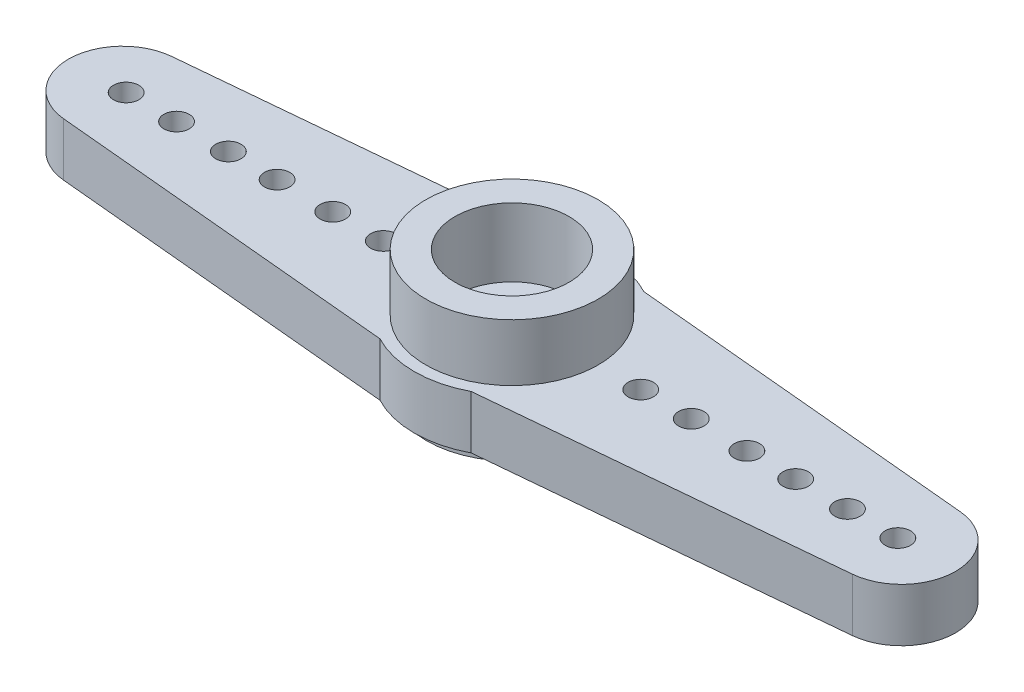
ISO-10303-21;
HEADER;
FILE_DESCRIPTION(('STEP AP214'),'2;1');
FILE_NAME('part.step','',(''),(''),'','','');
FILE_SCHEMA(('AUTOMOTIVE_DESIGN { 1 0 10303 214 1 1 1 1 }'));
ENDSEC;
DATA;
#1=APPLICATION_CONTEXT('core data for automotive mechanical design processes');
#2=APPLICATION_PROTOCOL_DEFINITION('international standard','automotive_design',2000,#1);
#3=PRODUCT_CONTEXT('',#1,'mechanical');
#4=PRODUCT('Part','Part','',(#3));
#5=PRODUCT_RELATED_PRODUCT_CATEGORY('part','',(#4));
#6=PRODUCT_DEFINITION_FORMATION('','',#4);
#7=PRODUCT_DEFINITION_CONTEXT('part definition',#1,'design');
#8=PRODUCT_DEFINITION('design','',#6,#7);
#9=PRODUCT_DEFINITION_SHAPE('','',#8);
#10=(LENGTH_UNIT() NAMED_UNIT(*) SI_UNIT(.MILLI.,.METRE.));
#11=(NAMED_UNIT(*) PLANE_ANGLE_UNIT() SI_UNIT($,.RADIAN.));
#12=(NAMED_UNIT(*) SI_UNIT($,.STERADIAN.) SOLID_ANGLE_UNIT());
#13=UNCERTAINTY_MEASURE_WITH_UNIT(LENGTH_MEASURE(1.E-05),#10,'distance_accuracy_value','');
#14=(GEOMETRIC_REPRESENTATION_CONTEXT(3) GLOBAL_UNCERTAINTY_ASSIGNED_CONTEXT((#13)) GLOBAL_UNIT_ASSIGNED_CONTEXT((#10,
#11,#12)) REPRESENTATION_CONTEXT('',''));
#15=CARTESIAN_POINT('',(0.,0.,0.));
#16=DIRECTION('',(0.,0.,1.));
#17=DIRECTION('',(1.,0.,0.));
#18=AXIS2_PLACEMENT_3D('',#15,#16,#17);
#19=CARTESIAN_POINT('',(0.,1.65,0.));
#20=DIRECTION('',(0.,1.,0.));
#21=DIRECTION('',(0.,0.,1.));
#22=AXIS2_PLACEMENT_3D('',#19,#20,#21);
#23=PLANE('',#22);
#24=CARTESIAN_POINT('',(0.,1.65,0.));
#25=DIRECTION('',(0.,1.,0.));
#26=DIRECTION('',(0.,0.,1.));
#27=AXIS2_PLACEMENT_3D('',#24,#25,#26);
#28=CIRCLE('',#27,1.15);
#29=CARTESIAN_POINT('',(0.,1.65,1.15));
#30=VERTEX_POINT('',#29);
#31=EDGE_CURVE('E20',#30,#30,#28,.F.);
#32=ORIENTED_EDGE('',*,*,#31,.T.);
#33=EDGE_LOOP('',(#32));
#34=FACE_BOUND('',#33,.T.);
#35=CARTESIAN_POINT('',(0.,1.65,0.));
#36=DIRECTION('',(0.,1.,0.));
#37=DIRECTION('',(0.,0.,1.));
#38=AXIS2_PLACEMENT_3D('',#35,#36,#37);
#39=CIRCLE('',#38,2.25);
#40=CARTESIAN_POINT('',(0.,1.65,2.25));
#41=VERTEX_POINT('',#40);
#42=EDGE_CURVE('E231',#41,#41,#39,.T.);
#43=ORIENTED_EDGE('',*,*,#42,.T.);
#44=EDGE_LOOP('',(#43));
#45=FACE_BOUND('',#44,.T.);
#46=ADVANCED_FACE('F17',(#34,#45),#23,.T.);
#47=CARTESIAN_POINT('',(0.,0.,0.));
#48=DIRECTION('',(0.,1.,0.));
#49=DIRECTION('',(0.,0.,1.));
#50=AXIS2_PLACEMENT_3D('',#47,#48,#49);
#51=CYLINDRICAL_SURFACE('',#50,1.15);
#52=ORIENTED_EDGE('',*,*,#31,.F.);
#53=EDGE_LOOP('',(#52));
#54=FACE_BOUND('',#53,.T.);
#55=CARTESIAN_POINT('',(0.,0.75,0.));
#56=DIRECTION('',(0.,1.,0.));
#57=DIRECTION('',(0.,0.,1.));
#58=AXIS2_PLACEMENT_3D('',#55,#56,#57);
#59=CIRCLE('',#58,1.15);
#60=CARTESIAN_POINT('',(0.,0.75,1.15));
#61=VERTEX_POINT('',#60);
#62=EDGE_CURVE('E229',#61,#61,#59,.T.);
#63=ORIENTED_EDGE('',*,*,#62,.F.);
#64=EDGE_LOOP('',(#63));
#65=FACE_BOUND('',#64,.T.);
#66=ADVANCED_FACE('F239',(#54,#65),#51,.F.);
#67=CARTESIAN_POINT('',(0.,1.65,0.));
#68=DIRECTION('',(0.,1.,0.));
#69=DIRECTION('',(0.,0.,1.));
#70=AXIS2_PLACEMENT_3D('',#67,#68,#69);
#71=CYLINDRICAL_SURFACE('',#70,2.25);
#72=ORIENTED_EDGE('',*,*,#42,.F.);
#73=EDGE_LOOP('',(#72));
#74=FACE_BOUND('',#73,.T.);
#75=CARTESIAN_POINT('',(0.,4.35,0.));
#76=DIRECTION('',(0.,1.,0.));
#77=DIRECTION('',(0.,0.,1.));
#78=AXIS2_PLACEMENT_3D('',#75,#76,#77);
#79=CIRCLE('',#78,2.25);
#80=CARTESIAN_POINT('',(0.,4.35,2.25));
#81=VERTEX_POINT('',#80);
#82=EDGE_CURVE('E226',#81,#81,#79,.F.);
#83=ORIENTED_EDGE('',*,*,#82,.F.);
#84=EDGE_LOOP('',(#83));
#85=FACE_BOUND('',#84,.T.);
#86=ADVANCED_FACE('F242',(#74,#85),#71,.F.);
#87=CARTESIAN_POINT('',(0.,0.75,0.));
#88=DIRECTION('',(0.,-1.,0.));
#89=DIRECTION('',(0.,0.,-1.));
#90=AXIS2_PLACEMENT_3D('',#87,#88,#89);
#91=PLANE('',#90);
#92=ORIENTED_EDGE('',*,*,#62,.T.);
#93=EDGE_LOOP('',(#92));
#94=FACE_BOUND('',#93,.T.);
#95=CARTESIAN_POINT('',(0.,0.75,0.));
#96=DIRECTION('',(0.,-1.,0.));
#97=DIRECTION('',(0.,0.,-1.));
#98=AXIS2_PLACEMENT_3D('',#95,#96,#97);
#99=CIRCLE('',#98,2.425);
#100=CARTESIAN_POINT('',(0.,0.75,-2.425));
#101=VERTEX_POINT('',#100);
#102=EDGE_CURVE('E223',#101,#101,#99,.T.);
#103=ORIENTED_EDGE('',*,*,#102,.T.);
#104=EDGE_LOOP('',(#103));
#105=FACE_BOUND('',#104,.T.);
#106=ADVANCED_FACE('F245',(#94,#105),#91,.T.);
#107=CARTESIAN_POINT('',(0.,4.35,0.));
#108=DIRECTION('',(0.,1.,0.));
#109=DIRECTION('',(0.,0.,1.));
#110=AXIS2_PLACEMENT_3D('',#107,#108,#109);
#111=PLANE('',#110);
#112=ORIENTED_EDGE('',*,*,#82,.T.);
#113=EDGE_LOOP('',(#112));
#114=FACE_BOUND('',#113,.T.);
#115=CARTESIAN_POINT('',(0.,4.35,0.));
#116=DIRECTION('',(0.,-1.,0.));
#117=DIRECTION('',(0.,0.,-1.));
#118=AXIS2_PLACEMENT_3D('',#115,#116,#117);
#119=CIRCLE('',#118,3.4);
#120=CARTESIAN_POINT('',(0.,4.35,-3.4));
#121=VERTEX_POINT('',#120);
#122=EDGE_CURVE('E220',#121,#121,#119,.T.);
#123=ORIENTED_EDGE('',*,*,#122,.F.);
#124=EDGE_LOOP('',(#123));
#125=FACE_BOUND('',#124,.T.);
#126=ADVANCED_FACE('F248',(#114,#125),#111,.T.);
#127=CARTESIAN_POINT('',(0.,0.75,0.));
#128=DIRECTION('',(0.,-1.,0.));
#129=DIRECTION('',(0.,0.,-1.));
#130=AXIS2_PLACEMENT_3D('',#127,#128,#129);
#131=CYLINDRICAL_SURFACE('',#130,2.425);
#132=ORIENTED_EDGE('',*,*,#102,.F.);
#133=EDGE_LOOP('',(#132));
#134=FACE_BOUND('',#133,.T.);
#135=CARTESIAN_POINT('',(0.,-0.5,0.));
#136=DIRECTION('',(0.,-1.,0.));
#137=DIRECTION('',(0.,0.,-1.));
#138=AXIS2_PLACEMENT_3D('',#135,#136,#137);
#139=CIRCLE('',#138,2.425);
#140=CARTESIAN_POINT('',(0.,-0.5,-2.425));
#141=VERTEX_POINT('',#140);
#142=EDGE_CURVE('E217',#141,#141,#139,.F.);
#143=ORIENTED_EDGE('',*,*,#142,.F.);
#144=EDGE_LOOP('',(#143));
#145=FACE_BOUND('',#144,.T.);
#146=ADVANCED_FACE('F252',(#134,#145),#131,.F.);
#147=CARTESIAN_POINT('',(0.,4.35,0.));
#148=DIRECTION('',(0.,-1.,0.));
#149=DIRECTION('',(0.,0.,-1.));
#150=AXIS2_PLACEMENT_3D('',#147,#148,#149);
#151=CYLINDRICAL_SURFACE('',#150,3.4);
#152=ORIENTED_EDGE('',*,*,#122,.T.);
#153=EDGE_LOOP('',(#152));
#154=FACE_BOUND('',#153,.T.);
#155=CARTESIAN_POINT('',(0.,2.1,0.));
#156=DIRECTION('',(0.,-1.,0.));
#157=DIRECTION('',(0.,0.,-1.));
#158=AXIS2_PLACEMENT_3D('',#155,#156,#157);
#159=CIRCLE('',#158,3.4);
#160=CARTESIAN_POINT('',(0.,2.1,-3.4));
#161=VERTEX_POINT('',#160);
#162=EDGE_CURVE('E214',#161,#161,#159,.F.);
#163=ORIENTED_EDGE('',*,*,#162,.T.);
#164=EDGE_LOOP('',(#163));
#165=FACE_BOUND('',#164,.T.);
#166=ADVANCED_FACE('F255',(#154,#165),#151,.T.);
#167=CARTESIAN_POINT('',(0.,-0.5,0.));
#168=DIRECTION('',(0.,-1.,0.));
#169=DIRECTION('',(0.,0.,-1.));
#170=AXIS2_PLACEMENT_3D('',#167,#168,#169);
#171=PLANE('',#170);
#172=CARTESIAN_POINT('',(0.,-0.5,0.));
#173=DIRECTION('',(0.,1.,0.));
#174=DIRECTION('',(0.,0.,1.));
#175=AXIS2_PLACEMENT_3D('',#172,#173,#174);
#176=CIRCLE('',#175,3.375);
#177=CARTESIAN_POINT('',(0.,-0.5,3.375));
#178=VERTEX_POINT('',#177);
#179=EDGE_CURVE('E211',#178,#178,#176,.T.);
#180=ORIENTED_EDGE('',*,*,#179,.F.);
#181=EDGE_LOOP('',(#180));
#182=FACE_BOUND('',#181,.T.);
#183=ORIENTED_EDGE('',*,*,#142,.T.);
#184=EDGE_LOOP('',(#183));
#185=FACE_BOUND('',#184,.T.);
#186=ADVANCED_FACE('F259',(#182,#185),#171,.T.);
#187=CARTESIAN_POINT('',(0.,2.1,0.));
#188=DIRECTION('',(0.,-1.,0.));
#189=DIRECTION('',(0.,0.,-1.));
#190=AXIS2_PLACEMENT_3D('',#187,#188,#189);
#191=PLANE('',#190);
#192=DIRECTION('',(-0.995716456666093,0.,0.0924593852689943));
#193=VECTOR('',#192,1.);
#194=CARTESIAN_POINT('',(-17.5,2.1,-1.95));
#195=LINE('',#194,#193);
#196=CARTESIAN_POINT('',(-15.5583528861857,2.1,-2.1302958011074));
#197=VERTEX_POINT('',#196);
#198=CARTESIAN_POINT('',(-1.79999999798423,2.1,-3.40785714209431));
#199=VERTEX_POINT('',#198);
#200=EDGE_CURVE('E87',#197,#199,#195,.F.);
#201=ORIENTED_EDGE('',*,*,#200,.F.);
#202=CARTESIAN_POINT('',(-15.3605397,2.1,0.));
#203=DIRECTION('',(0.,-1.,0.));
#204=DIRECTION('',(0.,0.,-1.));
#205=AXIS2_PLACEMENT_3D('',#202,#203,#204);
#206=CIRCLE('',#205,2.13946027);
#207=CARTESIAN_POINT('',(-15.5583528861545,2.1,2.1302958011103));
#208=VERTEX_POINT('',#207);
#209=EDGE_CURVE('E170',#208,#197,#206,.T.);
#210=ORIENTED_EDGE('',*,*,#209,.F.);
#211=DIRECTION('',(-0.995716456666093,0.,-0.0924593852689943));
#212=VECTOR('',#211,1.);
#213=CARTESIAN_POINT('',(-17.5,2.1,1.95));
#214=LINE('',#213,#212);
#215=CARTESIAN_POINT('',(-1.79999999790833,2.1,3.40785714316399));
#216=VERTEX_POINT('',#215);
#217=EDGE_CURVE('E110',#208,#216,#214,.F.);
#218=ORIENTED_EDGE('',*,*,#217,.T.);
#219=CARTESIAN_POINT('',(0.,2.1,0.));
#220=DIRECTION('',(0.,-1.,0.));
#221=DIRECTION('',(0.,0.,-1.));
#222=AXIS2_PLACEMENT_3D('',#219,#220,#221);
#223=CIRCLE('',#222,3.85402261198172);
#224=CARTESIAN_POINT('',(1.79999999798423,2.1,3.40785714209431));
#225=VERTEX_POINT('',#224);
#226=EDGE_CURVE('E117',#225,#216,#223,.T.);
#227=ORIENTED_EDGE('',*,*,#226,.F.);
#228=DIRECTION('',(0.995716456666093,0.,-0.0924593852689943));
#229=VECTOR('',#228,1.);
#230=CARTESIAN_POINT('',(17.5,2.1,1.95));
#231=LINE('',#230,#229);
#232=CARTESIAN_POINT('',(15.5583528863692,2.1,2.1302958034225));
#233=VERTEX_POINT('',#232);
#234=EDGE_CURVE('E114',#233,#225,#231,.F.);
#235=ORIENTED_EDGE('',*,*,#234,.F.);
#236=CARTESIAN_POINT('',(15.3605397,2.1,0.));
#237=DIRECTION('',(0.,-1.,0.));
#238=DIRECTION('',(0.,0.,-1.));
#239=AXIS2_PLACEMENT_3D('',#236,#237,#238);
#240=CIRCLE('',#239,2.13946027);
#241=CARTESIAN_POINT('',(15.5583528861545,2.1,-2.1302958011103));
#242=VERTEX_POINT('',#241);
#243=EDGE_CURVE('E174',#242,#233,#240,.T.);
#244=ORIENTED_EDGE('',*,*,#243,.F.);
#245=DIRECTION('',(0.995716456666093,0.,0.0924593852689943));
#246=VECTOR('',#245,1.);
#247=CARTESIAN_POINT('',(17.5,2.1,-1.95));
#248=LINE('',#247,#246);
#249=CARTESIAN_POINT('',(1.79999999786316,2.1,-3.40785714316819));
#250=VERTEX_POINT('',#249);
#251=EDGE_CURVE('E90',#242,#250,#248,.F.);
#252=ORIENTED_EDGE('',*,*,#251,.T.);
#253=CARTESIAN_POINT('',(0.,2.1,0.));
#254=DIRECTION('',(0.,-1.,0.));
#255=DIRECTION('',(0.,0.,-1.));
#256=AXIS2_PLACEMENT_3D('',#253,#254,#255);
#257=CIRCLE('',#256,3.85402261198172);
#258=EDGE_CURVE('E80',#199,#250,#257,.T.);
#259=ORIENTED_EDGE('',*,*,#258,.F.);
#260=EDGE_LOOP('',(#201,#210,#218,#227,#235,#244,#252,#259));
#261=FACE_BOUND('',#260,.T.);
#262=CARTESIAN_POINT('',(5.07826722,2.1,0.));
#263=DIRECTION('',(0.,1.,0.));
#264=DIRECTION('',(0.,0.,1.));
#265=AXIS2_PLACEMENT_3D('',#262,#263,#264);
#266=CIRCLE('',#265,0.5);
#267=CARTESIAN_POINT('',(5.07826722,2.1,0.5));
#268=VERTEX_POINT('',#267);
#269=EDGE_CURVE('E101',#268,#268,#266,.F.);
#270=ORIENTED_EDGE('',*,*,#269,.T.);
#271=EDGE_LOOP('',(#270));
#272=FACE_BOUND('',#271,.T.);
#273=CARTESIAN_POINT('',(7.07176458,2.1,0.));
#274=DIRECTION('',(0.,1.,0.));
#275=DIRECTION('',(0.,0.,1.));
#276=AXIS2_PLACEMENT_3D('',#273,#274,#275);
#277=CIRCLE('',#276,0.5);
#278=CARTESIAN_POINT('',(7.07176458,2.1,0.5));
#279=VERTEX_POINT('',#278);
#280=EDGE_CURVE('E178',#279,#279,#277,.F.);
#281=ORIENTED_EDGE('',*,*,#280,.T.);
#282=EDGE_LOOP('',(#281));
#283=FACE_BOUND('',#282,.T.);
#284=CARTESIAN_POINT('',(9.26628033,2.1,0.));
#285=DIRECTION('',(0.,1.,0.));
#286=DIRECTION('',(0.,0.,1.));
#287=AXIS2_PLACEMENT_3D('',#284,#285,#286);
#288=CIRCLE('',#287,0.5);
#289=CARTESIAN_POINT('',(9.26628033,2.1,0.5));
#290=VERTEX_POINT('',#289);
#291=EDGE_CURVE('E181',#290,#290,#288,.F.);
#292=ORIENTED_EDGE('',*,*,#291,.T.);
#293=EDGE_LOOP('',(#292));
#294=FACE_BOUND('',#293,.T.);
#295=CARTESIAN_POINT('',(11.1888846,2.1,0.));
#296=DIRECTION('',(0.,1.,0.));
#297=DIRECTION('',(0.,0.,1.));
#298=AXIS2_PLACEMENT_3D('',#295,#296,#297);
#299=CIRCLE('',#298,0.5);
#300=CARTESIAN_POINT('',(11.1888846,2.1,0.5));
#301=VERTEX_POINT('',#300);
#302=EDGE_CURVE('E184',#301,#301,#299,.F.);
#303=ORIENTED_EDGE('',*,*,#302,.T.);
#304=EDGE_LOOP('',(#303));
#305=FACE_BOUND('',#304,.T.);
#306=CARTESIAN_POINT('',(13.2338717,2.1,0.));
#307=DIRECTION('',(0.,1.,0.));
#308=DIRECTION('',(0.,0.,1.));
#309=AXIS2_PLACEMENT_3D('',#306,#307,#308);
#310=CIRCLE('',#309,0.5);
#311=CARTESIAN_POINT('',(13.2338717,2.1,0.5));
#312=VERTEX_POINT('',#311);
#313=EDGE_CURVE('E187',#312,#312,#310,.F.);
#314=ORIENTED_EDGE('',*,*,#313,.T.);
#315=EDGE_LOOP('',(#314));
#316=FACE_BOUND('',#315,.T.);
#317=CARTESIAN_POINT('',(15.2219818,2.1,0.));
#318=DIRECTION('',(0.,1.,0.));
#319=DIRECTION('',(0.,0.,1.));
#320=AXIS2_PLACEMENT_3D('',#317,#318,#319);
#321=CIRCLE('',#320,0.5);
#322=CARTESIAN_POINT('',(15.2219818,2.1,0.5));
#323=VERTEX_POINT('',#322);
#324=EDGE_CURVE('E190',#323,#323,#321,.F.);
#325=ORIENTED_EDGE('',*,*,#324,.T.);
#326=EDGE_LOOP('',(#325));
#327=FACE_BOUND('',#326,.T.);
#328=CARTESIAN_POINT('',(-15.2219818,2.1,0.));
#329=DIRECTION('',(0.,1.,0.));
#330=DIRECTION('',(0.,0.,1.));
#331=AXIS2_PLACEMENT_3D('',#328,#329,#330);
#332=CIRCLE('',#331,0.5);
#333=CARTESIAN_POINT('',(-15.2219818,2.1,0.5));
#334=VERTEX_POINT('',#333);
#335=EDGE_CURVE('E193',#334,#334,#332,.F.);
#336=ORIENTED_EDGE('',*,*,#335,.T.);
#337=EDGE_LOOP('',(#336));
#338=FACE_BOUND('',#337,.T.);
#339=CARTESIAN_POINT('',(-13.2338717,2.1,0.));
#340=DIRECTION('',(0.,1.,0.));
#341=DIRECTION('',(0.,0.,1.));
#342=AXIS2_PLACEMENT_3D('',#339,#340,#341);
#343=CIRCLE('',#342,0.5);
#344=CARTESIAN_POINT('',(-13.2338717,2.1,0.5));
#345=VERTEX_POINT('',#344);
#346=EDGE_CURVE('E196',#345,#345,#343,.F.);
#347=ORIENTED_EDGE('',*,*,#346,.T.);
#348=EDGE_LOOP('',(#347));
#349=FACE_BOUND('',#348,.T.);
#350=CARTESIAN_POINT('',(-11.1888846,2.1,0.));
#351=DIRECTION('',(0.,1.,0.));
#352=DIRECTION('',(0.,0.,1.));
#353=AXIS2_PLACEMENT_3D('',#350,#351,#352);
#354=CIRCLE('',#353,0.5);
#355=CARTESIAN_POINT('',(-11.1888846,2.1,0.5));
#356=VERTEX_POINT('',#355);
#357=EDGE_CURVE('E199',#356,#356,#354,.F.);
#358=ORIENTED_EDGE('',*,*,#357,.T.);
#359=EDGE_LOOP('',(#358));
#360=FACE_BOUND('',#359,.T.);
#361=CARTESIAN_POINT('',(-9.26628033,2.1,0.));
#362=DIRECTION('',(0.,1.,0.));
#363=DIRECTION('',(0.,0.,1.));
#364=AXIS2_PLACEMENT_3D('',#361,#362,#363);
#365=CIRCLE('',#364,0.5);
#366=CARTESIAN_POINT('',(-9.26628033,2.1,0.5));
#367=VERTEX_POINT('',#366);
#368=EDGE_CURVE('E202',#367,#367,#365,.F.);
#369=ORIENTED_EDGE('',*,*,#368,.T.);
#370=EDGE_LOOP('',(#369));
#371=FACE_BOUND('',#370,.T.);
#372=CARTESIAN_POINT('',(-7.07176458,2.1,0.));
#373=DIRECTION('',(0.,1.,0.));
#374=DIRECTION('',(0.,0.,1.));
#375=AXIS2_PLACEMENT_3D('',#372,#373,#374);
#376=CIRCLE('',#375,0.5);
#377=CARTESIAN_POINT('',(-7.07176458,2.1,0.5));
#378=VERTEX_POINT('',#377);
#379=EDGE_CURVE('E205',#378,#378,#376,.F.);
#380=ORIENTED_EDGE('',*,*,#379,.T.);
#381=EDGE_LOOP('',(#380));
#382=FACE_BOUND('',#381,.T.);
#383=CARTESIAN_POINT('',(-5.07826722,2.1,0.));
#384=DIRECTION('',(0.,1.,0.));
#385=DIRECTION('',(0.,0.,1.));
#386=AXIS2_PLACEMENT_3D('',#383,#384,#385);
#387=CIRCLE('',#386,0.5);
#388=CARTESIAN_POINT('',(-5.07826722,2.1,0.5));
#389=VERTEX_POINT('',#388);
#390=EDGE_CURVE('E208',#389,#389,#387,.F.);
#391=ORIENTED_EDGE('',*,*,#390,.T.);
#392=EDGE_LOOP('',(#391));
#393=FACE_BOUND('',#392,.T.);
#394=ORIENTED_EDGE('',*,*,#162,.F.);
#395=EDGE_LOOP('',(#394));
#396=FACE_BOUND('',#395,.T.);
#397=ADVANCED_FACE('F84',(#261,#272,#283,#294,#305,#316,#327,#338,#349,#360,#371,#382,#393,
#396),#191,.F.);
#398=CARTESIAN_POINT('',(0.,-0.5,0.));
#399=DIRECTION('',(0.,1.,0.));
#400=DIRECTION('',(0.,0.,1.));
#401=AXIS2_PLACEMENT_3D('',#398,#399,#400);
#402=CYLINDRICAL_SURFACE('',#401,3.375);
#403=ORIENTED_EDGE('',*,*,#179,.T.);
#404=EDGE_LOOP('',(#403));
#405=FACE_BOUND('',#404,.T.);
#406=CARTESIAN_POINT('',(0.,0.,0.));
#407=DIRECTION('',(0.,1.,0.));
#408=DIRECTION('',(0.,0.,1.));
#409=AXIS2_PLACEMENT_3D('',#406,#407,#408);
#410=CIRCLE('',#409,3.375);
#411=CARTESIAN_POINT('',(0.,0.,3.375));
#412=VERTEX_POINT('',#411);
#413=EDGE_CURVE('E167',#412,#412,#410,.T.);
#414=ORIENTED_EDGE('',*,*,#413,.F.);
#415=EDGE_LOOP('',(#414));
#416=FACE_BOUND('',#415,.T.);
#417=ADVANCED_FACE('F268',(#405,#416),#402,.T.);
#418=CARTESIAN_POINT('',(-5.07826722,-0.5,0.));
#419=DIRECTION('',(0.,1.,0.));
#420=DIRECTION('',(0.,0.,1.));
#421=AXIS2_PLACEMENT_3D('',#418,#419,#420);
#422=CYLINDRICAL_SURFACE('',#421,0.5);
#423=ORIENTED_EDGE('',*,*,#390,.F.);
#424=EDGE_LOOP('',(#423));
#425=FACE_BOUND('',#424,.T.);
#426=CARTESIAN_POINT('',(-5.07826722,0.,0.));
#427=DIRECTION('',(0.,1.,0.));
#428=DIRECTION('',(0.,0.,1.));
#429=AXIS2_PLACEMENT_3D('',#426,#427,#428);
#430=CIRCLE('',#429,0.5);
#431=CARTESIAN_POINT('',(-5.07826722,0.,0.5));
#432=VERTEX_POINT('',#431);
#433=EDGE_CURVE('E164',#432,#432,#430,.T.);
#434=ORIENTED_EDGE('',*,*,#433,.F.);
#435=EDGE_LOOP('',(#434));
#436=FACE_BOUND('',#435,.T.);
#437=ADVANCED_FACE('F352',(#425,#436),#422,.F.);
#438=CARTESIAN_POINT('',(-7.07176458,-0.5,0.));
#439=DIRECTION('',(0.,1.,0.));
#440=DIRECTION('',(0.,0.,1.));
#441=AXIS2_PLACEMENT_3D('',#438,#439,#440);
#442=CYLINDRICAL_SURFACE('',#441,0.5);
#443=ORIENTED_EDGE('',*,*,#379,.F.);
#444=EDGE_LOOP('',(#443));
#445=FACE_BOUND('',#444,.T.);
#446=CARTESIAN_POINT('',(-7.07176458,0.,0.));
#447=DIRECTION('',(0.,1.,0.));
#448=DIRECTION('',(0.,0.,1.));
#449=AXIS2_PLACEMENT_3D('',#446,#447,#448);
#450=CIRCLE('',#449,0.5);
#451=CARTESIAN_POINT('',(-7.07176458,0.,0.5));
#452=VERTEX_POINT('',#451);
#453=EDGE_CURVE('E161',#452,#452,#450,.T.);
#454=ORIENTED_EDGE('',*,*,#453,.F.);
#455=EDGE_LOOP('',(#454));
#456=FACE_BOUND('',#455,.T.);
#457=ADVANCED_FACE('F348',(#445,#456),#442,.F.);
#458=CARTESIAN_POINT('',(-9.26628033,-0.5,0.));
#459=DIRECTION('',(0.,1.,0.));
#460=DIRECTION('',(0.,0.,1.));
#461=AXIS2_PLACEMENT_3D('',#458,#459,#460);
#462=CYLINDRICAL_SURFACE('',#461,0.5);
#463=ORIENTED_EDGE('',*,*,#368,.F.);
#464=EDGE_LOOP('',(#463));
#465=FACE_BOUND('',#464,.T.);
#466=CARTESIAN_POINT('',(-9.26628033,0.,0.));
#467=DIRECTION('',(0.,1.,0.));
#468=DIRECTION('',(0.,0.,1.));
#469=AXIS2_PLACEMENT_3D('',#466,#467,#468);
#470=CIRCLE('',#469,0.5);
#471=CARTESIAN_POINT('',(-9.26628033,0.,0.5));
#472=VERTEX_POINT('',#471);
#473=EDGE_CURVE('E158',#472,#472,#470,.T.);
#474=ORIENTED_EDGE('',*,*,#473,.F.);
#475=EDGE_LOOP('',(#474));
#476=FACE_BOUND('',#475,.T.);
#477=ADVANCED_FACE('F344',(#465,#476),#462,.F.);
#478=CARTESIAN_POINT('',(-11.1888846,-0.5,0.));
#479=DIRECTION('',(0.,1.,0.));
#480=DIRECTION('',(0.,0.,1.));
#481=AXIS2_PLACEMENT_3D('',#478,#479,#480);
#482=CYLINDRICAL_SURFACE('',#481,0.5);
#483=ORIENTED_EDGE('',*,*,#357,.F.);
#484=EDGE_LOOP('',(#483));
#485=FACE_BOUND('',#484,.T.);
#486=CARTESIAN_POINT('',(-11.1888846,0.,0.));
#487=DIRECTION('',(0.,1.,0.));
#488=DIRECTION('',(0.,0.,1.));
#489=AXIS2_PLACEMENT_3D('',#486,#487,#488);
#490=CIRCLE('',#489,0.5);
#491=CARTESIAN_POINT('',(-11.1888846,0.,0.5));
#492=VERTEX_POINT('',#491);
#493=EDGE_CURVE('E155',#492,#492,#490,.T.);
#494=ORIENTED_EDGE('',*,*,#493,.F.);
#495=EDGE_LOOP('',(#494));
#496=FACE_BOUND('',#495,.T.);
#497=ADVANCED_FACE('F340',(#485,#496),#482,.F.);
#498=CARTESIAN_POINT('',(-13.2338717,-0.5,0.));
#499=DIRECTION('',(0.,1.,0.));
#500=DIRECTION('',(0.,0.,1.));
#501=AXIS2_PLACEMENT_3D('',#498,#499,#500);
#502=CYLINDRICAL_SURFACE('',#501,0.5);
#503=ORIENTED_EDGE('',*,*,#346,.F.);
#504=EDGE_LOOP('',(#503));
#505=FACE_BOUND('',#504,.T.);
#506=CARTESIAN_POINT('',(-13.2338717,0.,0.));
#507=DIRECTION('',(0.,1.,0.));
#508=DIRECTION('',(0.,0.,1.));
#509=AXIS2_PLACEMENT_3D('',#506,#507,#508);
#510=CIRCLE('',#509,0.5);
#511=CARTESIAN_POINT('',(-13.2338717,0.,0.5));
#512=VERTEX_POINT('',#511);
#513=EDGE_CURVE('E152',#512,#512,#510,.T.);
#514=ORIENTED_EDGE('',*,*,#513,.F.);
#515=EDGE_LOOP('',(#514));
#516=FACE_BOUND('',#515,.T.);
#517=ADVANCED_FACE('F336',(#505,#516),#502,.F.);
#518=CARTESIAN_POINT('',(-15.2219818,-0.5,0.));
#519=DIRECTION('',(0.,1.,0.));
#520=DIRECTION('',(0.,0.,1.));
#521=AXIS2_PLACEMENT_3D('',#518,#519,#520);
#522=CYLINDRICAL_SURFACE('',#521,0.5);
#523=ORIENTED_EDGE('',*,*,#335,.F.);
#524=EDGE_LOOP('',(#523));
#525=FACE_BOUND('',#524,.T.);
#526=CARTESIAN_POINT('',(-15.2219818,0.,0.));
#527=DIRECTION('',(0.,1.,0.));
#528=DIRECTION('',(0.,0.,1.));
#529=AXIS2_PLACEMENT_3D('',#526,#527,#528);
#530=CIRCLE('',#529,0.5);
#531=CARTESIAN_POINT('',(-15.2219818,0.,0.5));
#532=VERTEX_POINT('',#531);
#533=EDGE_CURVE('E149',#532,#532,#530,.T.);
#534=ORIENTED_EDGE('',*,*,#533,.F.);
#535=EDGE_LOOP('',(#534));
#536=FACE_BOUND('',#535,.T.);
#537=ADVANCED_FACE('F332',(#525,#536),#522,.F.);
#538=CARTESIAN_POINT('',(15.2219818,-0.5,0.));
#539=DIRECTION('',(0.,1.,0.));
#540=DIRECTION('',(0.,0.,1.));
#541=AXIS2_PLACEMENT_3D('',#538,#539,#540);
#542=CYLINDRICAL_SURFACE('',#541,0.5);
#543=ORIENTED_EDGE('',*,*,#324,.F.);
#544=EDGE_LOOP('',(#543));
#545=FACE_BOUND('',#544,.T.);
#546=CARTESIAN_POINT('',(15.2219818,0.,0.));
#547=DIRECTION('',(0.,1.,0.));
#548=DIRECTION('',(0.,0.,1.));
#549=AXIS2_PLACEMENT_3D('',#546,#547,#548);
#550=CIRCLE('',#549,0.5);
#551=CARTESIAN_POINT('',(15.2219818,0.,0.5));
#552=VERTEX_POINT('',#551);
#553=EDGE_CURVE('E146',#552,#552,#550,.T.);
#554=ORIENTED_EDGE('',*,*,#553,.F.);
#555=EDGE_LOOP('',(#554));
#556=FACE_BOUND('',#555,.T.);
#557=ADVANCED_FACE('F328',(#545,#556),#542,.F.);
#558=CARTESIAN_POINT('',(13.2338717,-0.5,0.));
#559=DIRECTION('',(0.,1.,0.));
#560=DIRECTION('',(0.,0.,1.));
#561=AXIS2_PLACEMENT_3D('',#558,#559,#560);
#562=CYLINDRICAL_SURFACE('',#561,0.5);
#563=ORIENTED_EDGE('',*,*,#313,.F.);
#564=EDGE_LOOP('',(#563));
#565=FACE_BOUND('',#564,.T.);
#566=CARTESIAN_POINT('',(13.2338717,0.,0.));
#567=DIRECTION('',(0.,1.,0.));
#568=DIRECTION('',(0.,0.,1.));
#569=AXIS2_PLACEMENT_3D('',#566,#567,#568);
#570=CIRCLE('',#569,0.5);
#571=CARTESIAN_POINT('',(13.2338717,0.,0.5));
#572=VERTEX_POINT('',#571);
#573=EDGE_CURVE('E143',#572,#572,#570,.T.);
#574=ORIENTED_EDGE('',*,*,#573,.F.);
#575=EDGE_LOOP('',(#574));
#576=FACE_BOUND('',#575,.T.);
#577=ADVANCED_FACE('F324',(#565,#576),#562,.F.);
#578=CARTESIAN_POINT('',(11.1888846,-0.5,0.));
#579=DIRECTION('',(0.,1.,0.));
#580=DIRECTION('',(0.,0.,1.));
#581=AXIS2_PLACEMENT_3D('',#578,#579,#580);
#582=CYLINDRICAL_SURFACE('',#581,0.5);
#583=ORIENTED_EDGE('',*,*,#302,.F.);
#584=EDGE_LOOP('',(#583));
#585=FACE_BOUND('',#584,.T.);
#586=CARTESIAN_POINT('',(11.1888846,0.,0.));
#587=DIRECTION('',(0.,1.,0.));
#588=DIRECTION('',(0.,0.,1.));
#589=AXIS2_PLACEMENT_3D('',#586,#587,#588);
#590=CIRCLE('',#589,0.5);
#591=CARTESIAN_POINT('',(11.1888846,0.,0.5));
#592=VERTEX_POINT('',#591);
#593=EDGE_CURVE('E140',#592,#592,#590,.T.);
#594=ORIENTED_EDGE('',*,*,#593,.F.);
#595=EDGE_LOOP('',(#594));
#596=FACE_BOUND('',#595,.T.);
#597=ADVANCED_FACE('F320',(#585,#596),#582,.F.);
#598=CARTESIAN_POINT('',(9.26628033,-0.5,0.));
#599=DIRECTION('',(0.,1.,0.));
#600=DIRECTION('',(0.,0.,1.));
#601=AXIS2_PLACEMENT_3D('',#598,#599,#600);
#602=CYLINDRICAL_SURFACE('',#601,0.5);
#603=ORIENTED_EDGE('',*,*,#291,.F.);
#604=EDGE_LOOP('',(#603));
#605=FACE_BOUND('',#604,.T.);
#606=CARTESIAN_POINT('',(9.26628033,0.,0.));
#607=DIRECTION('',(0.,1.,0.));
#608=DIRECTION('',(0.,0.,1.));
#609=AXIS2_PLACEMENT_3D('',#606,#607,#608);
#610=CIRCLE('',#609,0.5);
#611=CARTESIAN_POINT('',(9.26628033,0.,0.5));
#612=VERTEX_POINT('',#611);
#613=EDGE_CURVE('E137',#612,#612,#610,.T.);
#614=ORIENTED_EDGE('',*,*,#613,.F.);
#615=EDGE_LOOP('',(#614));
#616=FACE_BOUND('',#615,.T.);
#617=ADVANCED_FACE('F316',(#605,#616),#602,.F.);
#618=CARTESIAN_POINT('',(7.07176458,-0.5,0.));
#619=DIRECTION('',(0.,1.,0.));
#620=DIRECTION('',(0.,0.,1.));
#621=AXIS2_PLACEMENT_3D('',#618,#619,#620);
#622=CYLINDRICAL_SURFACE('',#621,0.5);
#623=ORIENTED_EDGE('',*,*,#280,.F.);
#624=EDGE_LOOP('',(#623));
#625=FACE_BOUND('',#624,.T.);
#626=CARTESIAN_POINT('',(7.07176458,0.,0.));
#627=DIRECTION('',(0.,1.,0.));
#628=DIRECTION('',(0.,0.,1.));
#629=AXIS2_PLACEMENT_3D('',#626,#627,#628);
#630=CIRCLE('',#629,0.5);
#631=CARTESIAN_POINT('',(7.07176458,0.,0.5));
#632=VERTEX_POINT('',#631);
#633=EDGE_CURVE('E134',#632,#632,#630,.T.);
#634=ORIENTED_EDGE('',*,*,#633,.F.);
#635=EDGE_LOOP('',(#634));
#636=FACE_BOUND('',#635,.T.);
#637=ADVANCED_FACE('F312',(#625,#636),#622,.F.);
#638=CARTESIAN_POINT('',(5.07826722,-0.5,0.));
#639=DIRECTION('',(0.,1.,0.));
#640=DIRECTION('',(0.,0.,1.));
#641=AXIS2_PLACEMENT_3D('',#638,#639,#640);
#642=CYLINDRICAL_SURFACE('',#641,0.5);
#643=ORIENTED_EDGE('',*,*,#269,.F.);
#644=EDGE_LOOP('',(#643));
#645=FACE_BOUND('',#644,.T.);
#646=CARTESIAN_POINT('',(5.07826722,0.,0.));
#647=DIRECTION('',(0.,1.,0.));
#648=DIRECTION('',(0.,0.,1.));
#649=AXIS2_PLACEMENT_3D('',#646,#647,#648);
#650=CIRCLE('',#649,0.5);
#651=CARTESIAN_POINT('',(5.07826722,0.,0.5));
#652=VERTEX_POINT('',#651);
#653=EDGE_CURVE('E131',#652,#652,#650,.T.);
#654=ORIENTED_EDGE('',*,*,#653,.F.);
#655=EDGE_LOOP('',(#654));
#656=FACE_BOUND('',#655,.T.);
#657=ADVANCED_FACE('F309',(#645,#656),#642,.F.);
#658=CARTESIAN_POINT('',(-17.5,2.1,-1.95));
#659=DIRECTION('',(-0.0924593852689943,0.,-0.995716456666093));
#660=DIRECTION('',(-0.995716456666093,0.,0.0924593852689943));
#661=AXIS2_PLACEMENT_3D('',#658,#659,#660);
#662=PLANE('',#661);
#663=ORIENTED_EDGE('',*,*,#200,.T.);
#664=DIRECTION('',(0.,-1.,0.));
#665=VECTOR('',#664,1.);
#666=CARTESIAN_POINT('',(-1.8000000004252,4.35,-3.40785714080501));
#667=LINE('',#666,#665);
#668=CARTESIAN_POINT('',(-1.80000000139514,0.,-3.4078571402927));
#669=VERTEX_POINT('',#668);
#670=EDGE_CURVE('E93',#669,#199,#667,.F.);
#671=ORIENTED_EDGE('',*,*,#670,.F.);
#672=DIRECTION('',(0.995716456678695,0.,-0.0924593851332824));
#673=VECTOR('',#672,1.);
#674=CARTESIAN_POINT('',(-15.5583528908381,0.,-2.13029580192914));
#675=LINE('',#674,#673);
#676=CARTESIAN_POINT('',(-15.5583528859909,0.,-2.13029580058629));
#677=VERTEX_POINT('',#676);
#678=EDGE_CURVE('E130',#677,#669,#675,.T.);
#679=ORIENTED_EDGE('',*,*,#678,.F.);
#680=DIRECTION('',(0.,-1.,0.));
#681=VECTOR('',#680,1.);
#682=CARTESIAN_POINT('',(-15.5583528905704,2.1,-2.13029579836811));
#683=LINE('',#682,#681);
#684=EDGE_CURVE('E99',#197,#677,#683,.T.);
#685=ORIENTED_EDGE('',*,*,#684,.F.);
#686=EDGE_LOOP('',(#663,#671,#679,#685));
#687=FACE_BOUND('',#686,.T.);
#688=ADVANCED_FACE('F96',(#687),#662,.T.);
#689=CARTESIAN_POINT('',(0.,4.35,0.));
#690=DIRECTION('',(0.,-1.,0.));
#691=DIRECTION('',(0.,0.,-1.));
#692=AXIS2_PLACEMENT_3D('',#689,#690,#691);
#693=CYLINDRICAL_SURFACE('',#692,3.85402261198172);
#694=DIRECTION('',(0.,1.,0.));
#695=VECTOR('',#694,1.);
#696=CARTESIAN_POINT('',(1.80000000018305,2.1,-3.40785714295277));
#697=LINE('',#696,#695);
#698=CARTESIAN_POINT('',(1.80000000127406,0.,-3.40785714136658));
#699=VERTEX_POINT('',#698);
#700=EDGE_CURVE('E92',#250,#699,#697,.F.);
#701=ORIENTED_EDGE('',*,*,#700,.T.);
#702=CARTESIAN_POINT('',(0.,0.,0.));
#703=DIRECTION('',(0.,-1.,0.));
#704=DIRECTION('',(0.,0.,-1.));
#705=AXIS2_PLACEMENT_3D('',#702,#703,#704);
#706=CIRCLE('',#705,3.85402261198172);
#707=EDGE_CURVE('E104',#669,#699,#706,.T.);
#708=ORIENTED_EDGE('',*,*,#707,.F.);
#709=ORIENTED_EDGE('',*,*,#670,.T.);
#710=ORIENTED_EDGE('',*,*,#258,.T.);
#711=EDGE_LOOP('',(#701,#708,#709,#710));
#712=FACE_BOUND('',#711,.T.);
#713=ADVANCED_FACE('F103',(#712),#693,.T.);
#714=CARTESIAN_POINT('',(17.5,2.1,-1.95));
#715=DIRECTION('',(-0.0924593852689943,0.,0.995716456666093));
#716=DIRECTION('',(0.995716456666093,0.,0.0924593852689943));
#717=AXIS2_PLACEMENT_3D('',#714,#715,#716);
#718=PLANE('',#717);
#719=DIRECTION('',(0.,-1.,0.));
#720=VECTOR('',#719,1.);
#721=CARTESIAN_POINT('',(15.558352890508,0.,-2.13029579837391));
#722=LINE('',#721,#720);
#723=CARTESIAN_POINT('',(15.5583528860314,0.,-2.13029579941647));
#724=VERTEX_POINT('',#723);
#725=EDGE_CURVE('E119',#724,#242,#722,.F.);
#726=ORIENTED_EDGE('',*,*,#725,.F.);
#727=DIRECTION('',(0.995716456663156,0.,0.0924593853006206));
#728=VECTOR('',#727,1.);
#729=CARTESIAN_POINT('',(1.8,0.,-3.40785714));
#730=LINE('',#729,#728);
#731=EDGE_CURVE('E128',#699,#724,#730,.T.);
#732=ORIENTED_EDGE('',*,*,#731,.F.);
#733=ORIENTED_EDGE('',*,*,#700,.F.);
#734=ORIENTED_EDGE('',*,*,#251,.F.);
#735=EDGE_LOOP('',(#726,#732,#733,#734));
#736=FACE_BOUND('',#735,.T.);
#737=ADVANCED_FACE('F300',(#736),#718,.F.);
#738=CARTESIAN_POINT('',(15.3605397,0.,0.));
#739=DIRECTION('',(0.,-1.,0.));
#740=DIRECTION('',(0.,0.,-1.));
#741=AXIS2_PLACEMENT_3D('',#738,#739,#740);
#742=CYLINDRICAL_SURFACE('',#741,2.13946027);
#743=DIRECTION('',(0.,1.,0.));
#744=VECTOR('',#743,1.);
#745=CARTESIAN_POINT('',(15.5583528909374,2.1,2.13029580299831));
#746=LINE('',#745,#744);
#747=CARTESIAN_POINT('',(15.5583528861744,0.,2.13029580290139));
#748=VERTEX_POINT('',#747);
#749=EDGE_CURVE('E118',#748,#233,#746,.T.);
#750=ORIENTED_EDGE('',*,*,#749,.F.);
#751=CARTESIAN_POINT('',(15.3605397,0.,0.));
#752=DIRECTION('',(0.,-1.,0.));
#753=DIRECTION('',(0.,0.,-1.));
#754=AXIS2_PLACEMENT_3D('',#751,#752,#753);
#755=CIRCLE('',#754,2.13946027);
#756=EDGE_CURVE('E125',#724,#748,#755,.T.);
#757=ORIENTED_EDGE('',*,*,#756,.F.);
#758=ORIENTED_EDGE('',*,*,#725,.T.);
#759=ORIENTED_EDGE('',*,*,#243,.T.);
#760=EDGE_LOOP('',(#750,#757,#758,#759));
#761=FACE_BOUND('',#760,.T.);
#762=ADVANCED_FACE('F296',(#761),#742,.T.);
#763=CARTESIAN_POINT('',(17.5,2.1,1.95));
#764=DIRECTION('',(0.0924593852689943,0.,0.995716456666093));
#765=DIRECTION('',(0.995716456666093,0.,-0.0924593852689943));
#766=AXIS2_PLACEMENT_3D('',#763,#764,#765);
#767=PLANE('',#766);
#768=ORIENTED_EDGE('',*,*,#234,.T.);
#769=DIRECTION('',(0.,-1.,0.));
#770=VECTOR('',#769,1.);
#771=CARTESIAN_POINT('',(1.8000000004252,4.35,3.40785714080501));
#772=LINE('',#771,#770);
#773=CARTESIAN_POINT('',(1.80000000139514,0.,3.4078571402927));
#774=VERTEX_POINT('',#773);
#775=EDGE_CURVE('E173',#774,#225,#772,.F.);
#776=ORIENTED_EDGE('',*,*,#775,.F.);
#777=DIRECTION('',(-0.995716456678695,0.,0.0924593851332823));
#778=VECTOR('',#777,1.);
#779=CARTESIAN_POINT('',(15.5583528908381,0.,2.13029580192914));
#780=LINE('',#779,#778);
#781=EDGE_CURVE('E124',#748,#774,#780,.T.);
#782=ORIENTED_EDGE('',*,*,#781,.F.);
#783=ORIENTED_EDGE('',*,*,#749,.T.);
#784=EDGE_LOOP('',(#768,#776,#782,#783));
#785=FACE_BOUND('',#784,.T.);
#786=ADVANCED_FACE('F292',(#785),#767,.T.);
#787=CARTESIAN_POINT('',(0.,4.35,0.));
#788=DIRECTION('',(0.,-1.,0.));
#789=DIRECTION('',(0.,0.,-1.));
#790=AXIS2_PLACEMENT_3D('',#787,#788,#789);
#791=CYLINDRICAL_SURFACE('',#790,3.85402261198172);
#792=CARTESIAN_POINT('',(0.,0.,0.));
#793=DIRECTION('',(0.,-1.,0.));
#794=DIRECTION('',(0.,0.,-1.));
#795=AXIS2_PLACEMENT_3D('',#792,#793,#794);
#796=CIRCLE('',#795,3.85402261198172);
#797=CARTESIAN_POINT('',(-1.80000000018227,0.,3.40785714196292));
#798=VERTEX_POINT('',#797);
#799=EDGE_CURVE('E121',#774,#798,#796,.T.);
#800=ORIENTED_EDGE('',*,*,#799,.F.);
#801=ORIENTED_EDGE('',*,*,#775,.T.);
#802=ORIENTED_EDGE('',*,*,#226,.T.);
#803=DIRECTION('',(0.,1.,0.));
#804=VECTOR('',#803,1.);
#805=CARTESIAN_POINT('',(-1.8000000002734,2.1,3.40785714294438));
#806=LINE('',#805,#804);
#807=EDGE_CURVE('E112',#216,#798,#806,.F.);
#808=ORIENTED_EDGE('',*,*,#807,.T.);
#809=EDGE_LOOP('',(#800,#801,#802,#808));
#810=FACE_BOUND('',#809,.T.);
#811=ADVANCED_FACE('F289',(#810),#791,.T.);
#812=CARTESIAN_POINT('',(-17.5,2.1,1.95));
#813=DIRECTION('',(0.0924593852689943,0.,-0.995716456666093));
#814=DIRECTION('',(-0.995716456666093,0.,-0.0924593852689943));
#815=AXIS2_PLACEMENT_3D('',#812,#813,#814);
#816=PLANE('',#815);
#817=DIRECTION('',(0.,-1.,0.));
#818=VECTOR('',#817,1.);
#819=CARTESIAN_POINT('',(-15.558352890508,2.1,2.13029579837391));
#820=LINE('',#819,#818);
#821=CARTESIAN_POINT('',(-15.5583528861073,0.,2.13029579940941));
#822=VERTEX_POINT('',#821);
#823=EDGE_CURVE('E35',#822,#208,#820,.F.);
#824=ORIENTED_EDGE('',*,*,#823,.F.);
#825=DIRECTION('',(-0.995716456656561,0.,-0.0924593853716506));
#826=VECTOR('',#825,1.);
#827=CARTESIAN_POINT('',(-1.80000000009113,0.,3.40785714098146));
#828=LINE('',#827,#826);
#829=EDGE_CURVE('E26',#798,#822,#828,.T.);
#830=ORIENTED_EDGE('',*,*,#829,.F.);
#831=ORIENTED_EDGE('',*,*,#807,.F.);
#832=ORIENTED_EDGE('',*,*,#217,.F.);
#833=EDGE_LOOP('',(#824,#830,#831,#832));
#834=FACE_BOUND('',#833,.T.);
#835=ADVANCED_FACE('F281',(#834),#816,.F.);
#836=CARTESIAN_POINT('',(-15.3605397,2.1,0.));
#837=DIRECTION('',(0.,-1.,0.));
#838=DIRECTION('',(0.,0.,-1.));
#839=AXIS2_PLACEMENT_3D('',#836,#837,#838);
#840=CYLINDRICAL_SURFACE('',#839,2.13946027);
#841=ORIENTED_EDGE('',*,*,#823,.T.);
#842=ORIENTED_EDGE('',*,*,#209,.T.);
#843=ORIENTED_EDGE('',*,*,#684,.T.);
#844=CARTESIAN_POINT('',(-15.3605397,0.,0.));
#845=DIRECTION('',(0.,-1.,0.));
#846=DIRECTION('',(0.,0.,-1.));
#847=AXIS2_PLACEMENT_3D('',#844,#845,#846);
#848=CIRCLE('',#847,2.13946027);
#849=EDGE_CURVE('E11',#822,#677,#848,.T.);
#850=ORIENTED_EDGE('',*,*,#849,.F.);
#851=EDGE_LOOP('',(#841,#842,#843,#850));
#852=FACE_BOUND('',#851,.T.);
#853=ADVANCED_FACE('F275',(#852),#840,.T.);
#854=CARTESIAN_POINT('',(0.,0.,0.));
#855=DIRECTION('',(0.,-1.,0.));
#856=DIRECTION('',(0.,0.,-1.));
#857=AXIS2_PLACEMENT_3D('',#854,#855,#856);
#858=PLANE('',#857);
#859=ORIENTED_EDGE('',*,*,#829,.T.);
#860=ORIENTED_EDGE('',*,*,#849,.T.);
#861=ORIENTED_EDGE('',*,*,#678,.T.);
#862=ORIENTED_EDGE('',*,*,#707,.T.);
#863=ORIENTED_EDGE('',*,*,#731,.T.);
#864=ORIENTED_EDGE('',*,*,#756,.T.);
#865=ORIENTED_EDGE('',*,*,#781,.T.);
#866=ORIENTED_EDGE('',*,*,#799,.T.);
#867=EDGE_LOOP('',(#859,#860,#861,#862,#863,#864,#865,#866));
#868=FACE_BOUND('',#867,.T.);
#869=ORIENTED_EDGE('',*,*,#653,.T.);
#870=EDGE_LOOP('',(#869));
#871=FACE_BOUND('',#870,.T.);
#872=ORIENTED_EDGE('',*,*,#633,.T.);
#873=EDGE_LOOP('',(#872));
#874=FACE_BOUND('',#873,.T.);
#875=ORIENTED_EDGE('',*,*,#613,.T.);
#876=EDGE_LOOP('',(#875));
#877=FACE_BOUND('',#876,.T.);
#878=ORIENTED_EDGE('',*,*,#593,.T.);
#879=EDGE_LOOP('',(#878));
#880=FACE_BOUND('',#879,.T.);
#881=ORIENTED_EDGE('',*,*,#573,.T.);
#882=EDGE_LOOP('',(#881));
#883=FACE_BOUND('',#882,.T.);
#884=ORIENTED_EDGE('',*,*,#553,.T.);
#885=EDGE_LOOP('',(#884));
#886=FACE_BOUND('',#885,.T.);
#887=ORIENTED_EDGE('',*,*,#533,.T.);
#888=EDGE_LOOP('',(#887));
#889=FACE_BOUND('',#888,.T.);
#890=ORIENTED_EDGE('',*,*,#513,.T.);
#891=EDGE_LOOP('',(#890));
#892=FACE_BOUND('',#891,.T.);
#893=ORIENTED_EDGE('',*,*,#493,.T.);
#894=EDGE_LOOP('',(#893));
#895=FACE_BOUND('',#894,.T.);
#896=ORIENTED_EDGE('',*,*,#473,.T.);
#897=EDGE_LOOP('',(#896));
#898=FACE_BOUND('',#897,.T.);
#899=ORIENTED_EDGE('',*,*,#453,.T.);
#900=EDGE_LOOP('',(#899));
#901=FACE_BOUND('',#900,.T.);
#902=ORIENTED_EDGE('',*,*,#433,.T.);
#903=EDGE_LOOP('',(#902));
#904=FACE_BOUND('',#903,.T.);
#905=ORIENTED_EDGE('',*,*,#413,.T.);
#906=EDGE_LOOP('',(#905));
#907=FACE_BOUND('',#906,.T.);
#908=ADVANCED_FACE('F273',(#868,#871,#874,#877,#880,#883,#886,#889,#892,#895,#898,#901,#904,
#907),#858,.T.);
#909=CLOSED_SHELL('',(#46,#66,#86,#106,#126,#146,#166,#186,#397,#417,#437,#457,#477,#497,#517,
#537,#557,#577,#597,#617,#637,#657,#688,#713,#737,#762,#786,#811,#835,#853,#908));
#910=MANIFOLD_SOLID_BREP('B1',#909);
#911=ADVANCED_BREP_SHAPE_REPRESENTATION('',(#18,#910),#14);
#912=SHAPE_DEFINITION_REPRESENTATION(#9,#911);
ENDSEC;
END-ISO-10303-21;
